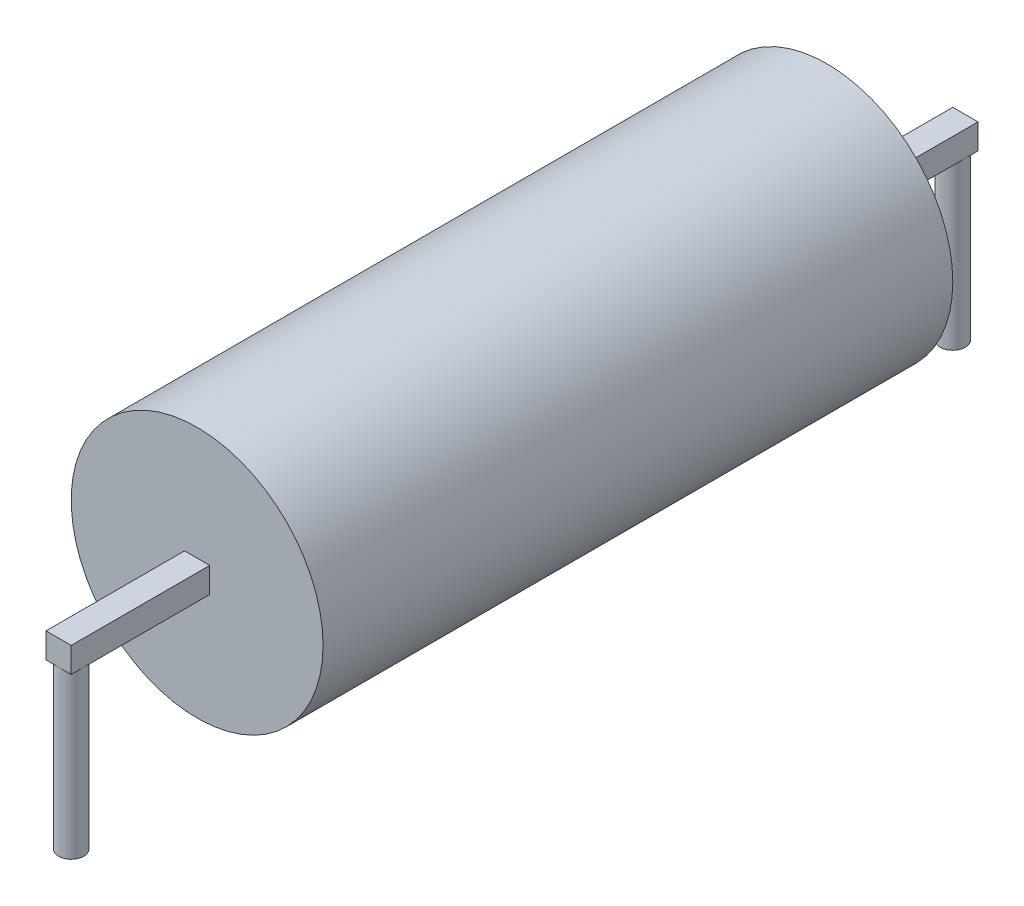
ISO-10303-21;
HEADER;
FILE_DESCRIPTION(('STEP AP214'),'2;1');
FILE_NAME('part.step','',(''),(''),'','','');
FILE_SCHEMA(('AUTOMOTIVE_DESIGN { 1 0 10303 214 1 1 1 1 }'));
ENDSEC;
DATA;
#1=APPLICATION_CONTEXT('core data for automotive mechanical design processes');
#2=APPLICATION_PROTOCOL_DEFINITION('international standard','automotive_design',2000,#1);
#3=PRODUCT_CONTEXT('',#1,'mechanical');
#4=PRODUCT('Part','Part','',(#3));
#5=PRODUCT_RELATED_PRODUCT_CATEGORY('part','',(#4));
#6=PRODUCT_DEFINITION_FORMATION('','',#4);
#7=PRODUCT_DEFINITION_CONTEXT('part definition',#1,'design');
#8=PRODUCT_DEFINITION('design','',#6,#7);
#9=PRODUCT_DEFINITION_SHAPE('','',#8);
#10=(LENGTH_UNIT() NAMED_UNIT(*) SI_UNIT(.MILLI.,.METRE.));
#11=(NAMED_UNIT(*) PLANE_ANGLE_UNIT() SI_UNIT($,.RADIAN.));
#12=(NAMED_UNIT(*) SI_UNIT($,.STERADIAN.) SOLID_ANGLE_UNIT());
#13=UNCERTAINTY_MEASURE_WITH_UNIT(LENGTH_MEASURE(1.E-05),#10,'distance_accuracy_value','');
#14=(GEOMETRIC_REPRESENTATION_CONTEXT(3) GLOBAL_UNCERTAINTY_ASSIGNED_CONTEXT((#13)) GLOBAL_UNIT_ASSIGNED_CONTEXT((#10,
#11,#12)) REPRESENTATION_CONTEXT('',''));
#15=CARTESIAN_POINT('',(0.,0.,0.));
#16=DIRECTION('',(0.,0.,1.));
#17=DIRECTION('',(1.,0.,0.));
#18=AXIS2_PLACEMENT_3D('',#15,#16,#17);
#19=CARTESIAN_POINT('',(-0.5,-0.5,30.5));
#20=DIRECTION('',(0.,1.,0.));
#21=DIRECTION('',(-1.,0.,0.));
#22=AXIS2_PLACEMENT_3D('',#19,#20,#21);
#23=PLANE('',#22);
#24=CARTESIAN_POINT('',(0.,-0.5,-5.));
#25=DIRECTION('',(0.,-1.,0.));
#26=DIRECTION('',(1.,0.,0.));
#27=AXIS2_PLACEMENT_3D('',#24,#25,#26);
#28=CIRCLE('',#27,0.5);
#29=CARTESIAN_POINT('',(-0.5,-0.5,-5.));
#30=VERTEX_POINT('',#29);
#31=CARTESIAN_POINT('',(0.,-0.5,-5.5));
#32=VERTEX_POINT('',#31);
#33=EDGE_CURVE('E132',#30,#32,#28,.T.);
#34=ORIENTED_EDGE('',*,*,#33,.F.);
#35=DIRECTION('',(0.,0.,-1.));
#36=VECTOR('',#35,1.);
#37=CARTESIAN_POINT('',(-0.5,-0.5,30.5));
#38=LINE('',#37,#36);
#39=CARTESIAN_POINT('',(-0.5,-0.5,-5.5));
#40=VERTEX_POINT('',#39);
#41=EDGE_CURVE('E119',#30,#40,#38,.T.);
#42=ORIENTED_EDGE('',*,*,#41,.T.);
#43=DIRECTION('',(1.,0.,0.));
#44=VECTOR('',#43,1.);
#45=CARTESIAN_POINT('',(-0.5,-0.5,-5.5));
#46=LINE('',#45,#44);
#47=EDGE_CURVE('E133',#40,#32,#46,.T.);
#48=ORIENTED_EDGE('',*,*,#47,.T.);
#49=EDGE_LOOP('',(#34,#42,#48));
#50=FACE_BOUND('',#49,.T.);
#51=ADVANCED_FACE('F31',(#50),#23,.F.);
#52=CARTESIAN_POINT('',(0.5,-0.5,-5.));
#53=VERTEX_POINT('',#52);
#54=EDGE_CURVE('E46',#32,#53,#28,.T.);
#55=ORIENTED_EDGE('',*,*,#54,.F.);
#56=CARTESIAN_POINT('',(0.5,-0.5,-5.5));
#57=VERTEX_POINT('',#56);
#58=EDGE_CURVE('E150',#32,#57,#46,.T.);
#59=ORIENTED_EDGE('',*,*,#58,.T.);
#60=DIRECTION('',(0.,0.,-1.));
#61=VECTOR('',#60,1.);
#62=CARTESIAN_POINT('',(0.5,-0.5,30.5));
#63=LINE('',#62,#61);
#64=EDGE_CURVE('E176',#53,#57,#63,.T.);
#65=ORIENTED_EDGE('',*,*,#64,.F.);
#66=EDGE_LOOP('',(#55,#59,#65));
#67=FACE_BOUND('',#66,.T.);
#68=ADVANCED_FACE('F231',(#67),#23,.F.);
#69=EDGE_CURVE('E54',#53,#30,#28,.T.);
#70=ORIENTED_EDGE('',*,*,#69,.F.);
#71=CARTESIAN_POINT('',(0.5,-0.5,0.));
#72=VERTEX_POINT('',#71);
#73=EDGE_CURVE('E179',#72,#53,#63,.T.);
#74=ORIENTED_EDGE('',*,*,#73,.F.);
#75=DIRECTION('',(-1.,0.,0.));
#76=VECTOR('',#75,1.);
#77=CARTESIAN_POINT('',(0.,-0.5,0.));
#78=LINE('',#77,#76);
#79=CARTESIAN_POINT('',(-0.5,-0.5,0.));
#80=VERTEX_POINT('',#79);
#81=EDGE_CURVE('E39',#72,#80,#78,.T.);
#82=ORIENTED_EDGE('',*,*,#81,.T.);
#83=EDGE_CURVE('E114',#80,#30,#38,.T.);
#84=ORIENTED_EDGE('',*,*,#83,.T.);
#85=EDGE_LOOP('',(#70,#74,#82,#84));
#86=FACE_BOUND('',#85,.T.);
#87=ADVANCED_FACE('F116',(#86),#23,.F.);
#88=CARTESIAN_POINT('',(0.,-0.5,30.));
#89=DIRECTION('',(0.,-1.,0.));
#90=DIRECTION('',(1.,0.,0.));
#91=AXIS2_PLACEMENT_3D('',#88,#89,#90);
#92=CIRCLE('',#91,0.5);
#93=CARTESIAN_POINT('',(-0.5,-0.5,30.));
#94=VERTEX_POINT('',#93);
#95=CARTESIAN_POINT('',(0.5,-0.5,30.));
#96=VERTEX_POINT('',#95);
#97=EDGE_CURVE('E139',#94,#96,#92,.T.);
#98=ORIENTED_EDGE('',*,*,#97,.F.);
#99=CARTESIAN_POINT('',(-0.5,-0.5,25.));
#100=VERTEX_POINT('',#99);
#101=EDGE_CURVE('E118',#94,#100,#38,.T.);
#102=ORIENTED_EDGE('',*,*,#101,.T.);
#103=DIRECTION('',(-1.,0.,0.));
#104=VECTOR('',#103,1.);
#105=CARTESIAN_POINT('',(0.,-0.5,25.));
#106=LINE('',#105,#104);
#107=CARTESIAN_POINT('',(0.5,-0.5,25.));
#108=VERTEX_POINT('',#107);
#109=EDGE_CURVE('E187',#108,#100,#106,.T.);
#110=ORIENTED_EDGE('',*,*,#109,.F.);
#111=EDGE_CURVE('E178',#96,#108,#63,.T.);
#112=ORIENTED_EDGE('',*,*,#111,.F.);
#113=EDGE_LOOP('',(#98,#102,#110,#112));
#114=FACE_BOUND('',#113,.T.);
#115=ADVANCED_FACE('F233',(#114),#23,.F.);
#116=CARTESIAN_POINT('',(0.,-0.5,30.5));
#117=VERTEX_POINT('',#116);
#118=EDGE_CURVE('E145',#96,#117,#92,.T.);
#119=ORIENTED_EDGE('',*,*,#118,.F.);
#120=CARTESIAN_POINT('',(0.5,-0.5,30.5));
#121=VERTEX_POINT('',#120);
#122=EDGE_CURVE('E130',#121,#96,#63,.T.);
#123=ORIENTED_EDGE('',*,*,#122,.F.);
#124=DIRECTION('',(1.,0.,0.));
#125=VECTOR('',#124,1.);
#126=CARTESIAN_POINT('',(-0.5,-0.5,30.5));
#127=LINE('',#126,#125);
#128=EDGE_CURVE('E161',#117,#121,#127,.T.);
#129=ORIENTED_EDGE('',*,*,#128,.F.);
#130=EDGE_LOOP('',(#119,#123,#129));
#131=FACE_BOUND('',#130,.T.);
#132=ADVANCED_FACE('F240',(#131),#23,.F.);
#133=EDGE_CURVE('E148',#117,#94,#92,.T.);
#134=ORIENTED_EDGE('',*,*,#133,.F.);
#135=CARTESIAN_POINT('',(-0.5,-0.5,30.5));
#136=VERTEX_POINT('',#135);
#137=EDGE_CURVE('E162',#136,#117,#127,.T.);
#138=ORIENTED_EDGE('',*,*,#137,.F.);
#139=EDGE_CURVE('E121',#136,#94,#38,.T.);
#140=ORIENTED_EDGE('',*,*,#139,.T.);
#141=EDGE_LOOP('',(#134,#138,#140));
#142=FACE_BOUND('',#141,.T.);
#143=ADVANCED_FACE('F226',(#142),#23,.F.);
#144=CARTESIAN_POINT('',(0.,0.,25.));
#145=DIRECTION('',(0.,0.,1.));
#146=DIRECTION('',(1.,0.,0.));
#147=AXIS2_PLACEMENT_3D('',#144,#145,#146);
#148=PLANE('',#147);
#149=CARTESIAN_POINT('',(0.,0.,25.));
#150=DIRECTION('',(0.,0.,1.));
#151=DIRECTION('',(1.,0.,0.));
#152=AXIS2_PLACEMENT_3D('',#149,#150,#151);
#153=CIRCLE('',#152,5.);
#154=CARTESIAN_POINT('',(5.,0.,25.));
#155=VERTEX_POINT('',#154);
#156=EDGE_CURVE('E194',#155,#155,#153,.T.);
#157=ORIENTED_EDGE('',*,*,#156,.T.);
#158=EDGE_LOOP('',(#157));
#159=FACE_BOUND('',#158,.T.);
#160=ORIENTED_EDGE('',*,*,#109,.T.);
#161=DIRECTION('',(0.,1.,0.));
#162=VECTOR('',#161,1.);
#163=CARTESIAN_POINT('',(-0.5,0.,25.));
#164=LINE('',#163,#162);
#165=CARTESIAN_POINT('',(-0.5,0.5,25.));
#166=VERTEX_POINT('',#165);
#167=EDGE_CURVE('E190',#100,#166,#164,.T.);
#168=ORIENTED_EDGE('',*,*,#167,.T.);
#169=DIRECTION('',(1.,0.,0.));
#170=VECTOR('',#169,1.);
#171=CARTESIAN_POINT('',(0.,0.5,25.));
#172=LINE('',#171,#170);
#173=CARTESIAN_POINT('',(0.5,0.5,25.));
#174=VERTEX_POINT('',#173);
#175=EDGE_CURVE('E181',#166,#174,#172,.T.);
#176=ORIENTED_EDGE('',*,*,#175,.T.);
#177=DIRECTION('',(0.,-1.,0.));
#178=VECTOR('',#177,1.);
#179=CARTESIAN_POINT('',(0.5,0.,25.));
#180=LINE('',#179,#178);
#181=EDGE_CURVE('E184',#174,#108,#180,.T.);
#182=ORIENTED_EDGE('',*,*,#181,.T.);
#183=EDGE_LOOP('',(#160,#168,#176,#182));
#184=FACE_BOUND('',#183,.T.);
#185=ADVANCED_FACE('F219',(#159,#184),#148,.T.);
#186=CARTESIAN_POINT('',(0.,0.,0.));
#187=DIRECTION('',(0.,0.,1.));
#188=DIRECTION('',(1.,0.,0.));
#189=AXIS2_PLACEMENT_3D('',#186,#187,#188);
#190=PLANE('',#189);
#191=CARTESIAN_POINT('',(0.,0.,0.));
#192=DIRECTION('',(0.,0.,1.));
#193=DIRECTION('',(1.,0.,0.));
#194=AXIS2_PLACEMENT_3D('',#191,#192,#193);
#195=CIRCLE('',#194,5.);
#196=CARTESIAN_POINT('',(5.,0.,0.));
#197=VERTEX_POINT('',#196);
#198=EDGE_CURVE('E193',#197,#197,#195,.T.);
#199=ORIENTED_EDGE('',*,*,#198,.F.);
#200=EDGE_LOOP('',(#199));
#201=FACE_BOUND('',#200,.T.);
#202=DIRECTION('',(0.,1.,0.));
#203=VECTOR('',#202,1.);
#204=CARTESIAN_POINT('',(-0.5,0.,0.));
#205=LINE('',#204,#203);
#206=CARTESIAN_POINT('',(-0.5,0.5,0.));
#207=VERTEX_POINT('',#206);
#208=EDGE_CURVE('E11',#80,#207,#205,.T.);
#209=ORIENTED_EDGE('',*,*,#208,.F.);
#210=ORIENTED_EDGE('',*,*,#81,.F.);
#211=DIRECTION('',(0.,-1.,0.));
#212=VECTOR('',#211,1.);
#213=CARTESIAN_POINT('',(0.5,0.,0.));
#214=LINE('',#213,#212);
#215=CARTESIAN_POINT('',(0.5,0.5,0.));
#216=VERTEX_POINT('',#215);
#217=EDGE_CURVE('E202',#216,#72,#214,.T.);
#218=ORIENTED_EDGE('',*,*,#217,.F.);
#219=DIRECTION('',(1.,0.,0.));
#220=VECTOR('',#219,1.);
#221=CARTESIAN_POINT('',(0.,0.5,0.));
#222=LINE('',#221,#220);
#223=EDGE_CURVE('E197',#207,#216,#222,.T.);
#224=ORIENTED_EDGE('',*,*,#223,.F.);
#225=EDGE_LOOP('',(#209,#210,#218,#224));
#226=FACE_BOUND('',#225,.T.);
#227=ADVANCED_FACE('F217',(#201,#226),#190,.F.);
#228=CARTESIAN_POINT('',(0.,0.,25.));
#229=DIRECTION('',(0.,0.,-1.));
#230=DIRECTION('',(-1.,0.,0.));
#231=AXIS2_PLACEMENT_3D('',#228,#229,#230);
#232=CYLINDRICAL_SURFACE('',#231,5.);
#233=ORIENTED_EDGE('',*,*,#156,.F.);
#234=EDGE_LOOP('',(#233));
#235=FACE_BOUND('',#234,.T.);
#236=ORIENTED_EDGE('',*,*,#198,.T.);
#237=EDGE_LOOP('',(#236));
#238=FACE_BOUND('',#237,.T.);
#239=ADVANCED_FACE('F33',(#235,#238),#232,.T.);
#240=CARTESIAN_POINT('',(-0.5,-0.5,-5.5));
#241=DIRECTION('',(0.,0.,-1.));
#242=DIRECTION('',(-1.,0.,0.));
#243=AXIS2_PLACEMENT_3D('',#240,#241,#242);
#244=PLANE('',#243);
#245=DIRECTION('',(0.,-1.,0.));
#246=VECTOR('',#245,1.);
#247=CARTESIAN_POINT('',(-0.5,-0.5,-5.5));
#248=LINE('',#247,#246);
#249=CARTESIAN_POINT('',(-0.5,0.5,-5.5));
#250=VERTEX_POINT('',#249);
#251=EDGE_CURVE('E126',#250,#40,#248,.T.);
#252=ORIENTED_EDGE('',*,*,#251,.F.);
#253=DIRECTION('',(-1.,0.,0.));
#254=VECTOR('',#253,1.);
#255=CARTESIAN_POINT('',(-0.5,0.5,-5.5));
#256=LINE('',#255,#254);
#257=CARTESIAN_POINT('',(0.5,0.5,-5.5));
#258=VERTEX_POINT('',#257);
#259=EDGE_CURVE('E155',#258,#250,#256,.T.);
#260=ORIENTED_EDGE('',*,*,#259,.F.);
#261=DIRECTION('',(0.,1.,0.));
#262=VECTOR('',#261,1.);
#263=CARTESIAN_POINT('',(0.5,-0.5,-5.5));
#264=LINE('',#263,#262);
#265=EDGE_CURVE('E152',#57,#258,#264,.T.);
#266=ORIENTED_EDGE('',*,*,#265,.F.);
#267=ORIENTED_EDGE('',*,*,#58,.F.);
#268=ORIENTED_EDGE('',*,*,#47,.F.);
#269=EDGE_LOOP('',(#252,#260,#266,#267,#268));
#270=FACE_BOUND('',#269,.T.);
#271=ADVANCED_FACE('F213',(#270),#244,.T.);
#272=CARTESIAN_POINT('',(-0.5,0.5,30.5));
#273=DIRECTION('',(0.,-1.,0.));
#274=DIRECTION('',(1.,0.,0.));
#275=AXIS2_PLACEMENT_3D('',#272,#273,#274);
#276=PLANE('',#275);
#277=DIRECTION('',(0.,0.,-1.));
#278=VECTOR('',#277,1.);
#279=CARTESIAN_POINT('',(-0.5,0.5,30.5));
#280=LINE('',#279,#278);
#281=EDGE_CURVE('E169',#207,#250,#280,.T.);
#282=ORIENTED_EDGE('',*,*,#281,.F.);
#283=ORIENTED_EDGE('',*,*,#223,.T.);
#284=DIRECTION('',(0.,0.,-1.));
#285=VECTOR('',#284,1.);
#286=CARTESIAN_POINT('',(0.5,0.5,30.5));
#287=LINE('',#286,#285);
#288=EDGE_CURVE('E173',#216,#258,#287,.T.);
#289=ORIENTED_EDGE('',*,*,#288,.T.);
#290=ORIENTED_EDGE('',*,*,#259,.T.);
#291=EDGE_LOOP('',(#282,#283,#289,#290));
#292=FACE_BOUND('',#291,.T.);
#293=ADVANCED_FACE('F216',(#292),#276,.F.);
#294=CARTESIAN_POINT('',(0.5,-0.5,30.5));
#295=DIRECTION('',(-1.,0.,0.));
#296=DIRECTION('',(0.,-1.,0.));
#297=AXIS2_PLACEMENT_3D('',#294,#295,#296);
#298=PLANE('',#297);
#299=ORIENTED_EDGE('',*,*,#288,.F.);
#300=ORIENTED_EDGE('',*,*,#217,.T.);
#301=ORIENTED_EDGE('',*,*,#73,.T.);
#302=ORIENTED_EDGE('',*,*,#64,.T.);
#303=ORIENTED_EDGE('',*,*,#265,.T.);
#304=EDGE_LOOP('',(#299,#300,#301,#302,#303));
#305=FACE_BOUND('',#304,.T.);
#306=ADVANCED_FACE('F207',(#305),#298,.F.);
#307=CARTESIAN_POINT('',(-0.5,-0.5,30.5));
#308=DIRECTION('',(1.,0.,0.));
#309=DIRECTION('',(0.,1.,0.));
#310=AXIS2_PLACEMENT_3D('',#307,#308,#309);
#311=PLANE('',#310);
#312=ORIENTED_EDGE('',*,*,#83,.F.);
#313=ORIENTED_EDGE('',*,*,#208,.T.);
#314=ORIENTED_EDGE('',*,*,#281,.T.);
#315=ORIENTED_EDGE('',*,*,#251,.T.);
#316=ORIENTED_EDGE('',*,*,#41,.F.);
#317=EDGE_LOOP('',(#312,#313,#314,#315,#316));
#318=FACE_BOUND('',#317,.T.);
#319=ADVANCED_FACE('F124',(#318),#311,.F.);
#320=ORIENTED_EDGE('',*,*,#167,.F.);
#321=ORIENTED_EDGE('',*,*,#101,.F.);
#322=ORIENTED_EDGE('',*,*,#139,.F.);
#323=DIRECTION('',(0.,-1.,0.));
#324=VECTOR('',#323,1.);
#325=CARTESIAN_POINT('',(-0.5,-0.5,30.5));
#326=LINE('',#325,#324);
#327=CARTESIAN_POINT('',(-0.5,0.5,30.5));
#328=VERTEX_POINT('',#327);
#329=EDGE_CURVE('E158',#328,#136,#326,.T.);
#330=ORIENTED_EDGE('',*,*,#329,.F.);
#331=EDGE_CURVE('E170',#328,#166,#280,.T.);
#332=ORIENTED_EDGE('',*,*,#331,.T.);
#333=EDGE_LOOP('',(#320,#321,#322,#330,#332));
#334=FACE_BOUND('',#333,.T.);
#335=ADVANCED_FACE('F276',(#334),#311,.F.);
#336=ORIENTED_EDGE('',*,*,#181,.F.);
#337=CARTESIAN_POINT('',(0.5,0.5,30.5));
#338=VERTEX_POINT('',#337);
#339=EDGE_CURVE('E174',#338,#174,#287,.T.);
#340=ORIENTED_EDGE('',*,*,#339,.F.);
#341=DIRECTION('',(0.,1.,0.));
#342=VECTOR('',#341,1.);
#343=CARTESIAN_POINT('',(0.5,-0.5,30.5));
#344=LINE('',#343,#342);
#345=EDGE_CURVE('E165',#121,#338,#344,.T.);
#346=ORIENTED_EDGE('',*,*,#345,.F.);
#347=ORIENTED_EDGE('',*,*,#122,.T.);
#348=ORIENTED_EDGE('',*,*,#111,.T.);
#349=EDGE_LOOP('',(#336,#340,#346,#347,#348));
#350=FACE_BOUND('',#349,.T.);
#351=ADVANCED_FACE('F269',(#350),#298,.F.);
#352=ORIENTED_EDGE('',*,*,#175,.F.);
#353=ORIENTED_EDGE('',*,*,#331,.F.);
#354=DIRECTION('',(-1.,0.,0.));
#355=VECTOR('',#354,1.);
#356=CARTESIAN_POINT('',(-0.5,0.5,30.5));
#357=LINE('',#356,#355);
#358=EDGE_CURVE('E167',#338,#328,#357,.T.);
#359=ORIENTED_EDGE('',*,*,#358,.F.);
#360=ORIENTED_EDGE('',*,*,#339,.T.);
#361=EDGE_LOOP('',(#352,#353,#359,#360));
#362=FACE_BOUND('',#361,.T.);
#363=ADVANCED_FACE('F274',(#362),#276,.F.);
#364=CARTESIAN_POINT('',(-0.5,-0.5,30.5));
#365=DIRECTION('',(0.,0.,-1.));
#366=DIRECTION('',(-1.,0.,0.));
#367=AXIS2_PLACEMENT_3D('',#364,#365,#366);
#368=PLANE('',#367);
#369=ORIENTED_EDGE('',*,*,#329,.T.);
#370=ORIENTED_EDGE('',*,*,#137,.T.);
#371=ORIENTED_EDGE('',*,*,#128,.T.);
#372=ORIENTED_EDGE('',*,*,#345,.T.);
#373=ORIENTED_EDGE('',*,*,#358,.T.);
#374=EDGE_LOOP('',(#369,#370,#371,#372,#373));
#375=FACE_BOUND('',#374,.T.);
#376=ADVANCED_FACE('F262',(#375),#368,.F.);
#377=CARTESIAN_POINT('',(0.,-7.,30.));
#378=DIRECTION('',(0.,1.,0.));
#379=DIRECTION('',(-1.,0.,0.));
#380=AXIS2_PLACEMENT_3D('',#377,#378,#379);
#381=CYLINDRICAL_SURFACE('',#380,0.5);
#382=CARTESIAN_POINT('',(0.,-7.,30.));
#383=DIRECTION('',(0.,-1.,0.));
#384=DIRECTION('',(1.,0.,0.));
#385=AXIS2_PLACEMENT_3D('',#382,#383,#384);
#386=CIRCLE('',#385,0.5);
#387=CARTESIAN_POINT('',(0.500000000000001,-7.,30.));
#388=VERTEX_POINT('',#387);
#389=EDGE_CURVE('E142',#388,#388,#386,.T.);
#390=ORIENTED_EDGE('',*,*,#389,.F.);
#391=EDGE_LOOP('',(#390));
#392=FACE_BOUND('',#391,.T.);
#393=ORIENTED_EDGE('',*,*,#118,.T.);
#394=ORIENTED_EDGE('',*,*,#133,.T.);
#395=ORIENTED_EDGE('',*,*,#97,.T.);
#396=EDGE_LOOP('',(#393,#394,#395));
#397=FACE_BOUND('',#396,.T.);
#398=ADVANCED_FACE('F264',(#392,#397),#381,.T.);
#399=CARTESIAN_POINT('',(0.,-7.,30.));
#400=DIRECTION('',(0.,-1.,0.));
#401=DIRECTION('',(1.,0.,0.));
#402=AXIS2_PLACEMENT_3D('',#399,#400,#401);
#403=PLANE('',#402);
#404=ORIENTED_EDGE('',*,*,#389,.T.);
#405=EDGE_LOOP('',(#404));
#406=FACE_BOUND('',#405,.T.);
#407=ADVANCED_FACE('F298',(#406),#403,.T.);
#408=CARTESIAN_POINT('',(0.,-7.,-5.));
#409=DIRECTION('',(0.,1.,0.));
#410=DIRECTION('',(-1.,0.,0.));
#411=AXIS2_PLACEMENT_3D('',#408,#409,#410);
#412=CYLINDRICAL_SURFACE('',#411,0.5);
#413=CARTESIAN_POINT('',(0.,-7.,-5.));
#414=DIRECTION('',(0.,-1.,0.));
#415=DIRECTION('',(1.,0.,0.));
#416=AXIS2_PLACEMENT_3D('',#413,#414,#415);
#417=CIRCLE('',#416,0.5);
#418=CARTESIAN_POINT('',(0.500000000000001,-7.,-5.));
#419=VERTEX_POINT('',#418);
#420=EDGE_CURVE('E137',#419,#419,#417,.T.);
#421=ORIENTED_EDGE('',*,*,#420,.F.);
#422=EDGE_LOOP('',(#421));
#423=FACE_BOUND('',#422,.T.);
#424=ORIENTED_EDGE('',*,*,#69,.T.);
#425=ORIENTED_EDGE('',*,*,#33,.T.);
#426=ORIENTED_EDGE('',*,*,#54,.T.);
#427=EDGE_LOOP('',(#424,#425,#426));
#428=FACE_BOUND('',#427,.T.);
#429=ADVANCED_FACE('F136',(#423,#428),#412,.T.);
#430=CARTESIAN_POINT('',(0.,-7.,-5.));
#431=DIRECTION('',(0.,-1.,0.));
#432=DIRECTION('',(1.,0.,0.));
#433=AXIS2_PLACEMENT_3D('',#430,#431,#432);
#434=PLANE('',#433);
#435=ORIENTED_EDGE('',*,*,#420,.T.);
#436=EDGE_LOOP('',(#435));
#437=FACE_BOUND('',#436,.T.);
#438=ADVANCED_FACE('F305',(#437),#434,.T.);
#439=CLOSED_SHELL('',(#51,#68,#87,#115,#132,#143,#185,#227,#239,#271,#293,#306,#319,#335,#351,
#363,#376,#398,#407,#429,#438));
#440=MANIFOLD_SOLID_BREP('B2',#439);
#441=ADVANCED_BREP_SHAPE_REPRESENTATION('',(#18,#440),#14);
#442=SHAPE_DEFINITION_REPRESENTATION(#9,#441);
ENDSEC;
END-ISO-10303-21;
